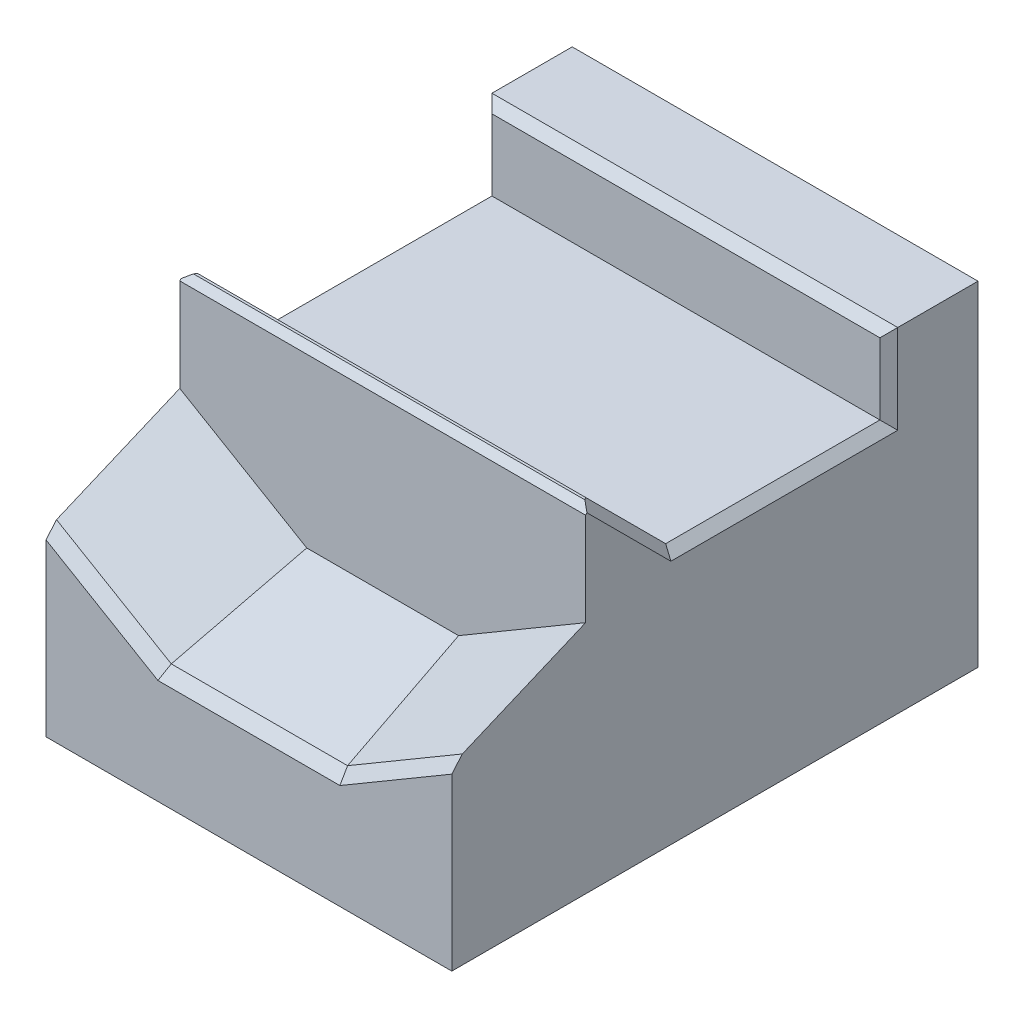
ISO-10303-21;
HEADER;
FILE_DESCRIPTION(('STEP AP214'),'2;1');
FILE_NAME('part.step','',(''),(''),'','','');
FILE_SCHEMA(('AUTOMOTIVE_DESIGN { 1 0 10303 214 1 1 1 1 }'));
ENDSEC;
DATA;
#1=APPLICATION_CONTEXT('core data for automotive mechanical design processes');
#2=APPLICATION_PROTOCOL_DEFINITION('international standard','automotive_design',2000,#1);
#3=PRODUCT_CONTEXT('',#1,'mechanical');
#4=PRODUCT('Part','Part','',(#3));
#5=PRODUCT_RELATED_PRODUCT_CATEGORY('part','',(#4));
#6=PRODUCT_DEFINITION_FORMATION('','',#4);
#7=PRODUCT_DEFINITION_CONTEXT('part definition',#1,'design');
#8=PRODUCT_DEFINITION('design','',#6,#7);
#9=PRODUCT_DEFINITION_SHAPE('','',#8);
#10=(LENGTH_UNIT() NAMED_UNIT(*) SI_UNIT(.MILLI.,.METRE.));
#11=(NAMED_UNIT(*) PLANE_ANGLE_UNIT() SI_UNIT($,.RADIAN.));
#12=(NAMED_UNIT(*) SI_UNIT($,.STERADIAN.) SOLID_ANGLE_UNIT());
#13=UNCERTAINTY_MEASURE_WITH_UNIT(LENGTH_MEASURE(1.E-05),#10,'distance_accuracy_value','');
#14=(GEOMETRIC_REPRESENTATION_CONTEXT(3) GLOBAL_UNCERTAINTY_ASSIGNED_CONTEXT((#13)) GLOBAL_UNIT_ASSIGNED_CONTEXT((#10,
#11,#12)) REPRESENTATION_CONTEXT('',''));
#15=CARTESIAN_POINT('',(0.,0.,0.));
#16=DIRECTION('',(0.,0.,1.));
#17=DIRECTION('',(1.,0.,0.));
#18=AXIS2_PLACEMENT_3D('',#15,#16,#17);
#19=CARTESIAN_POINT('',(455.,375.,880.));
#20=DIRECTION('',(0.,-1.,0.));
#21=DIRECTION('',(0.,0.,-1.));
#22=AXIS2_PLACEMENT_3D('',#19,#20,#21);
#23=PLANE('',#22);
#24=DIRECTION('',(0.,0.,-1.));
#25=VECTOR('',#24,1.);
#26=CARTESIAN_POINT('',(-455.,375.,880.));
#27=LINE('',#26,#25);
#28=CARTESIAN_POINT('',(-455.,375.,180.));
#29=VERTEX_POINT('',#28);
#30=CARTESIAN_POINT('',(-455.,375.,0.));
#31=VERTEX_POINT('',#30);
#32=EDGE_CURVE('E200',#29,#31,#27,.T.);
#33=ORIENTED_EDGE('',*,*,#32,.F.);
#34=DIRECTION('',(1.,0.,0.));
#35=VECTOR('',#34,1.);
#36=CARTESIAN_POINT('',(455.,375.,180.));
#37=LINE('',#36,#35);
#38=CARTESIAN_POINT('',(455.,375.,180.));
#39=VERTEX_POINT('',#38);
#40=EDGE_CURVE('E11',#29,#39,#37,.T.);
#41=ORIENTED_EDGE('',*,*,#40,.T.);
#42=DIRECTION('',(0.,0.,-1.));
#43=VECTOR('',#42,1.);
#44=CARTESIAN_POINT('',(455.,375.,880.));
#45=LINE('',#44,#43);
#46=CARTESIAN_POINT('',(455.,375.,0.));
#47=VERTEX_POINT('',#46);
#48=EDGE_CURVE('E213',#39,#47,#45,.T.);
#49=ORIENTED_EDGE('',*,*,#48,.T.);
#50=DIRECTION('',(-1.,0.,0.));
#51=VECTOR('',#50,1.);
#52=CARTESIAN_POINT('',(455.,375.,0.));
#53=LINE('',#52,#51);
#54=EDGE_CURVE('E205',#47,#31,#53,.T.);
#55=ORIENTED_EDGE('',*,*,#54,.T.);
#56=EDGE_LOOP('',(#33,#41,#49,#55));
#57=FACE_BOUND('',#56,.T.);
#58=ADVANCED_FACE('F43',(#57),#23,.F.);
#59=CARTESIAN_POINT('',(0.,0.,880.));
#60=DIRECTION('',(0.,0.,-1.));
#61=DIRECTION('',(-1.,0.,0.));
#62=AXIS2_PLACEMENT_3D('',#59,#60,#61);
#63=PLANE('',#62);
#64=DIRECTION('',(0.,1.,0.));
#65=VECTOR('',#64,1.);
#66=CARTESIAN_POINT('',(455.,-375.,880.));
#67=LINE('',#66,#65);
#68=CARTESIAN_POINT('',(455.,151.681443153843,880.));
#69=VERTEX_POINT('',#68);
#70=CARTESIAN_POINT('',(455.,360.5,880.));
#71=VERTEX_POINT('',#70);
#72=EDGE_CURVE('E214',#69,#71,#67,.T.);
#73=ORIENTED_EDGE('',*,*,#72,.T.);
#74=DIRECTION('',(-1.,0.,0.));
#75=VECTOR('',#74,1.);
#76=CARTESIAN_POINT('',(0.,360.5,880.));
#77=LINE('',#76,#75);
#78=CARTESIAN_POINT('',(-455.,360.5,880.));
#79=VERTEX_POINT('',#78);
#80=EDGE_CURVE('E236',#71,#79,#77,.T.);
#81=ORIENTED_EDGE('',*,*,#80,.T.);
#82=DIRECTION('',(0.,-1.,0.));
#83=VECTOR('',#82,1.);
#84=CARTESIAN_POINT('',(-455.,-375.,880.));
#85=LINE('',#84,#83);
#86=CARTESIAN_POINT('',(-455.,151.681443153843,880.));
#87=VERTEX_POINT('',#86);
#88=EDGE_CURVE('E206',#79,#87,#85,.T.);
#89=ORIENTED_EDGE('',*,*,#88,.T.);
#90=DIRECTION('',(0.86193421515777,-0.507020126563394,0.));
#91=VECTOR('',#90,1.);
#92=CARTESIAN_POINT('',(-144.637929727112,-30.8844805360909,880.));
#93=LINE('',#92,#91);
#94=CARTESIAN_POINT('',(-170.266366114231,-15.8089297201387,880.));
#95=VERTEX_POINT('',#94);
#96=EDGE_CURVE('E224',#87,#95,#93,.T.);
#97=ORIENTED_EDGE('',*,*,#96,.T.);
#98=DIRECTION('',(1.,0.,0.));
#99=VECTOR('',#98,1.);
#100=CARTESIAN_POINT('',(200.,-15.8089297201387,880.));
#101=LINE('',#100,#99);
#102=CARTESIAN_POINT('',(170.266366114231,-15.8089297201387,880.));
#103=VERTEX_POINT('',#102);
#104=EDGE_CURVE('E228',#95,#103,#101,.T.);
#105=ORIENTED_EDGE('',*,*,#104,.T.);
#106=DIRECTION('',(0.86193421515777,0.507020126563394,0.));
#107=VECTOR('',#106,1.);
#108=CARTESIAN_POINT('',(399.637929727112,119.115519463909,880.));
#109=LINE('',#108,#107);
#110=EDGE_CURVE('E226',#103,#69,#109,.T.);
#111=ORIENTED_EDGE('',*,*,#110,.T.);
#112=EDGE_LOOP('',(#73,#81,#89,#97,#105,#111));
#113=FACE_BOUND('',#112,.T.);
#114=ADVANCED_FACE('F360',(#113),#63,.F.);
#115=DIRECTION('',(-1.,0.,0.));
#116=VECTOR('',#115,1.);
#117=CARTESIAN_POINT('',(455.,375.,860.000000000003));
#118=LINE('',#117,#116);
#119=CARTESIAN_POINT('',(435.,375.,860.000000000003));
#120=VERTEX_POINT('',#119);
#121=CARTESIAN_POINT('',(-435.,375.,860.000000000003));
#122=VERTEX_POINT('',#121);
#123=EDGE_CURVE('E269',#120,#122,#118,.T.);
#124=ORIENTED_EDGE('',*,*,#123,.T.);
#125=DIRECTION('',(0.57735026918963,0.,-0.816496580927723));
#126=VECTOR('',#125,1.);
#127=CARTESIAN_POINT('',(-276.270683244605,375.,635.522847498312));
#128=LINE('',#127,#126);
#129=CARTESIAN_POINT('',(-438.889087296524,375.,865.5));
#130=VERTEX_POINT('',#129);
#131=EDGE_CURVE('E291',#122,#130,#128,.F.);
#132=ORIENTED_EDGE('',*,*,#131,.T.);
#133=DIRECTION('',(1.,0.,0.));
#134=VECTOR('',#133,1.);
#135=CARTESIAN_POINT('',(455.,375.,865.5));
#136=LINE('',#135,#134);
#137=CARTESIAN_POINT('',(438.889087296524,375.,865.5));
#138=VERTEX_POINT('',#137);
#139=EDGE_CURVE('E247',#130,#138,#136,.T.);
#140=ORIENTED_EDGE('',*,*,#139,.T.);
#141=DIRECTION('',(0.57735026918963,0.,0.816496580927723));
#142=VECTOR('',#141,1.);
#143=CARTESIAN_POINT('',(276.270683244605,375.,635.522847498312));
#144=LINE('',#143,#142);
#145=EDGE_CURVE('E293',#138,#120,#144,.F.);
#146=ORIENTED_EDGE('',*,*,#145,.T.);
#147=EDGE_LOOP('',(#124,#132,#140,#146));
#148=FACE_BOUND('',#147,.T.);
#149=ADVANCED_FACE('F399',(#148),#23,.F.);
#150=CARTESIAN_POINT('',(-455.,-375.,880.));
#151=DIRECTION('',(1.,0.,0.));
#152=DIRECTION('',(0.,0.,-1.));
#153=AXIS2_PLACEMENT_3D('',#150,#151,#152);
#154=PLANE('',#153);
#155=DIRECTION('',(0.,-0.707106781186542,0.707106781186553));
#156=VECTOR('',#155,1.);
#157=CARTESIAN_POINT('',(-455.,360.5,880.));
#158=LINE('',#157,#156);
#159=CARTESIAN_POINT('',(-455.,363.607864376268,876.892135623732));
#160=VERTEX_POINT('',#159);
#161=EDGE_CURVE('E246',#79,#160,#158,.F.);
#162=ORIENTED_EDGE('',*,*,#161,.T.);
#163=DIRECTION('',(0.,-0.707106781186544,-0.707106781186551));
#164=VECTOR('',#163,1.);
#165=CARTESIAN_POINT('',(-455.,181.237925885467,694.52219713293));
#166=LINE('',#165,#164);
#167=CARTESIAN_POINT('',(-455.,175.380061509198,688.664332756661));
#168=VERTEX_POINT('',#167);
#169=EDGE_CURVE('E284',#160,#168,#166,.T.);
#170=ORIENTED_EDGE('',*,*,#169,.T.);
#171=DIRECTION('',(0.,0.,-1.));
#172=VECTOR('',#171,1.);
#173=CARTESIAN_POINT('',(-455.,175.380061509198,880.));
#174=LINE('',#173,#172);
#175=CARTESIAN_POINT('',(-455.,175.380061509198,180.));
#176=VERTEX_POINT('',#175);
#177=EDGE_CURVE('E285',#168,#176,#174,.T.);
#178=ORIENTED_EDGE('',*,*,#177,.T.);
#179=DIRECTION('',(0.,1.,0.));
#180=VECTOR('',#179,1.);
#181=CARTESIAN_POINT('',(-455.,-375.,180.));
#182=LINE('',#181,#180);
#183=EDGE_CURVE('E277',#176,#29,#182,.T.);
#184=ORIENTED_EDGE('',*,*,#183,.T.);
#185=ORIENTED_EDGE('',*,*,#32,.T.);
#186=DIRECTION('',(0.,-1.,0.));
#187=VECTOR('',#186,1.);
#188=CARTESIAN_POINT('',(-455.,-375.,0.));
#189=LINE('',#188,#187);
#190=CARTESIAN_POINT('',(-455.,-375.,0.));
#191=VERTEX_POINT('',#190);
#192=EDGE_CURVE('E193',#31,#191,#189,.T.);
#193=ORIENTED_EDGE('',*,*,#192,.T.);
#194=DIRECTION('',(0.,0.,-1.));
#195=VECTOR('',#194,1.);
#196=CARTESIAN_POINT('',(-455.,-375.,880.));
#197=LINE('',#196,#195);
#198=CARTESIAN_POINT('',(-455.,-375.,1180.));
#199=VERTEX_POINT('',#198);
#200=EDGE_CURVE('E188',#199,#191,#197,.T.);
#201=ORIENTED_EDGE('',*,*,#200,.F.);
#202=DIRECTION('',(0.,-1.,0.));
#203=VECTOR('',#202,1.);
#204=CARTESIAN_POINT('',(-455.,-375.,1180.));
#205=LINE('',#204,#203);
#206=CARTESIAN_POINT('',(-455.,7.59727977354491,1180.));
#207=VERTEX_POINT('',#206);
#208=EDGE_CURVE('E176',#207,#199,#205,.T.);
#209=ORIENTED_EDGE('',*,*,#208,.F.);
#210=DIRECTION('',(0.,0.757460436382234,-0.652881066746184));
#211=VECTOR('',#210,1.);
#212=CARTESIAN_POINT('',(-455.,-84.2829391602115,1259.19470439519));
#213=LINE('',#212,#211);
#214=CARTESIAN_POINT('',(-455.,34.9587668674332,1156.41619809618));
#215=VERTEX_POINT('',#214);
#216=EDGE_CURVE('E263',#207,#215,#213,.T.);
#217=ORIENTED_EDGE('',*,*,#216,.T.);
#218=DIRECTION('',(0.,-0.389010546757677,0.921233300804575));
#219=VECTOR('',#218,1.);
#220=CARTESIAN_POINT('',(-455.,71.9791588157265,1068.74654966156));
#221=LINE('',#220,#219);
#222=EDGE_CURVE('E234',#215,#87,#221,.F.);
#223=ORIENTED_EDGE('',*,*,#222,.T.);
#224=ORIENTED_EDGE('',*,*,#88,.F.);
#225=EDGE_LOOP('',(#162,#170,#178,#184,#185,#193,#201,#209,#217,#223,#224));
#226=FACE_BOUND('',#225,.T.);
#227=ADVANCED_FACE('F191',(#226),#154,.F.);
#228=CARTESIAN_POINT('',(455.,-375.,880.));
#229=DIRECTION('',(0.,1.,0.));
#230=DIRECTION('',(0.,0.,1.));
#231=AXIS2_PLACEMENT_3D('',#228,#229,#230);
#232=PLANE('',#231);
#233=DIRECTION('',(1.,0.,0.));
#234=VECTOR('',#233,1.);
#235=CARTESIAN_POINT('',(455.,-375.,0.));
#236=LINE('',#235,#234);
#237=CARTESIAN_POINT('',(455.,-375.,0.));
#238=VERTEX_POINT('',#237);
#239=EDGE_CURVE('E220',#191,#238,#236,.T.);
#240=ORIENTED_EDGE('',*,*,#239,.T.);
#241=DIRECTION('',(0.,0.,-1.));
#242=VECTOR('',#241,1.);
#243=CARTESIAN_POINT('',(455.,-375.,880.));
#244=LINE('',#243,#242);
#245=CARTESIAN_POINT('',(455.,-375.,1180.));
#246=VERTEX_POINT('',#245);
#247=EDGE_CURVE('E196',#246,#238,#244,.T.);
#248=ORIENTED_EDGE('',*,*,#247,.F.);
#249=DIRECTION('',(1.,0.,0.));
#250=VECTOR('',#249,1.);
#251=CARTESIAN_POINT('',(-455.,-375.,1180.));
#252=LINE('',#251,#250);
#253=EDGE_CURVE('E181',#199,#246,#252,.T.);
#254=ORIENTED_EDGE('',*,*,#253,.F.);
#255=ORIENTED_EDGE('',*,*,#200,.T.);
#256=EDGE_LOOP('',(#240,#248,#254,#255));
#257=FACE_BOUND('',#256,.T.);
#258=ADVANCED_FACE('F197',(#257),#232,.F.);
#259=CARTESIAN_POINT('',(455.,-375.,880.));
#260=DIRECTION('',(-1.,0.,0.));
#261=DIRECTION('',(0.,0.,1.));
#262=AXIS2_PLACEMENT_3D('',#259,#260,#261);
#263=PLANE('',#262);
#264=DIRECTION('',(0.,0.,1.));
#265=VECTOR('',#264,1.);
#266=CARTESIAN_POINT('',(455.,175.380061509198,880.));
#267=LINE('',#266,#265);
#268=CARTESIAN_POINT('',(455.,175.380061509198,180.));
#269=VERTEX_POINT('',#268);
#270=CARTESIAN_POINT('',(455.,175.380061509198,688.664332756661));
#271=VERTEX_POINT('',#270);
#272=EDGE_CURVE('E301',#269,#271,#267,.T.);
#273=ORIENTED_EDGE('',*,*,#272,.T.);
#274=DIRECTION('',(0.,0.707106781186544,0.707106781186551));
#275=VECTOR('',#274,1.);
#276=CARTESIAN_POINT('',(455.,360.857864376269,874.142135623734));
#277=LINE('',#276,#275);
#278=CARTESIAN_POINT('',(455.,363.607864376268,876.892135623732));
#279=VERTEX_POINT('',#278);
#280=EDGE_CURVE('E303',#271,#279,#277,.T.);
#281=ORIENTED_EDGE('',*,*,#280,.T.);
#282=DIRECTION('',(0.,0.707106781186542,-0.707106781186553));
#283=VECTOR('',#282,1.);
#284=CARTESIAN_POINT('',(455.,360.5,880.));
#285=LINE('',#284,#283);
#286=EDGE_CURVE('E252',#279,#71,#285,.F.);
#287=ORIENTED_EDGE('',*,*,#286,.T.);
#288=ORIENTED_EDGE('',*,*,#72,.F.);
#289=DIRECTION('',(0.,0.389010546757677,-0.921233300804575));
#290=VECTOR('',#289,1.);
#291=CARTESIAN_POINT('',(455.,71.9791588157265,1068.74654966156));
#292=LINE('',#291,#290);
#293=CARTESIAN_POINT('',(455.,34.9587668674332,1156.41619809618));
#294=VERTEX_POINT('',#293);
#295=EDGE_CURVE('E233',#69,#294,#292,.F.);
#296=ORIENTED_EDGE('',*,*,#295,.T.);
#297=DIRECTION('',(0.,-0.757460436382234,0.652881066746184));
#298=VECTOR('',#297,1.);
#299=CARTESIAN_POINT('',(455.,-84.2829391602116,1259.19470439519));
#300=LINE('',#299,#298);
#301=CARTESIAN_POINT('',(455.,7.59727977354491,1180.));
#302=VERTEX_POINT('',#301);
#303=EDGE_CURVE('E270',#294,#302,#300,.T.);
#304=ORIENTED_EDGE('',*,*,#303,.T.);
#305=DIRECTION('',(0.,1.,0.));
#306=VECTOR('',#305,1.);
#307=CARTESIAN_POINT('',(455.,-375.,1180.));
#308=LINE('',#307,#306);
#309=EDGE_CURVE('E190',#246,#302,#308,.T.);
#310=ORIENTED_EDGE('',*,*,#309,.F.);
#311=ORIENTED_EDGE('',*,*,#247,.T.);
#312=DIRECTION('',(0.,1.,0.));
#313=VECTOR('',#312,1.);
#314=CARTESIAN_POINT('',(455.,-375.,0.));
#315=LINE('',#314,#313);
#316=EDGE_CURVE('E211',#238,#47,#315,.T.);
#317=ORIENTED_EDGE('',*,*,#316,.T.);
#318=ORIENTED_EDGE('',*,*,#48,.F.);
#319=DIRECTION('',(0.,-1.,0.));
#320=VECTOR('',#319,1.);
#321=CARTESIAN_POINT('',(455.,-375.,180.));
#322=LINE('',#321,#320);
#323=EDGE_CURVE('E299',#39,#269,#322,.T.);
#324=ORIENTED_EDGE('',*,*,#323,.T.);
#325=EDGE_LOOP('',(#273,#281,#287,#288,#296,#304,#310,#311,#317,#318,#324));
#326=FACE_BOUND('',#325,.T.);
#327=ADVANCED_FACE('F381',(#326),#263,.F.);
#328=CARTESIAN_POINT('',(0.,0.,0.));
#329=DIRECTION('',(0.,0.,-1.));
#330=DIRECTION('',(-1.,0.,0.));
#331=AXIS2_PLACEMENT_3D('',#328,#329,#330);
#332=PLANE('',#331);
#333=ORIENTED_EDGE('',*,*,#54,.F.);
#334=ORIENTED_EDGE('',*,*,#316,.F.);
#335=ORIENTED_EDGE('',*,*,#239,.F.);
#336=ORIENTED_EDGE('',*,*,#192,.F.);
#337=EDGE_LOOP('',(#333,#334,#335,#336));
#338=FACE_BOUND('',#337,.T.);
#339=ADVANCED_FACE('F432',(#338),#332,.T.);
#340=CARTESIAN_POINT('',(0.,0.,1180.));
#341=DIRECTION('',(0.,0.,-1.));
#342=DIRECTION('',(-1.,0.,0.));
#343=AXIS2_PLACEMENT_3D('',#340,#341,#342);
#344=PLANE('',#343);
#345=DIRECTION('',(-1.,0.,0.));
#346=VECTOR('',#345,1.);
#347=CARTESIAN_POINT('',(0.,-140.,1180.));
#348=LINE('',#347,#346);
#349=CARTESIAN_POINT('',(204.084624384974,-140.,1180.));
#350=VERTEX_POINT('',#349);
#351=CARTESIAN_POINT('',(-204.084624384974,-140.,1180.));
#352=VERTEX_POINT('',#351);
#353=EDGE_CURVE('E260',#350,#352,#348,.T.);
#354=ORIENTED_EDGE('',*,*,#353,.T.);
#355=DIRECTION('',(-0.86193421515777,0.507020126563394,0.));
#356=VECTOR('',#355,1.);
#357=CARTESIAN_POINT('',(-113.646433003849,-193.198936106544,1180.));
#358=LINE('',#357,#356);
#359=EDGE_CURVE('E183',#352,#207,#358,.T.);
#360=ORIENTED_EDGE('',*,*,#359,.T.);
#361=ORIENTED_EDGE('',*,*,#208,.T.);
#362=ORIENTED_EDGE('',*,*,#253,.T.);
#363=ORIENTED_EDGE('',*,*,#309,.T.);
#364=DIRECTION('',(-0.86193421515777,-0.507020126563394,0.));
#365=VECTOR('',#364,1.);
#366=CARTESIAN_POINT('',(113.646433003849,-193.198936106544,1180.));
#367=LINE('',#366,#365);
#368=EDGE_CURVE('E259',#302,#350,#367,.T.);
#369=ORIENTED_EDGE('',*,*,#368,.T.);
#370=EDGE_LOOP('',(#354,#360,#361,#362,#363,#369));
#371=FACE_BOUND('',#370,.T.);
#372=ADVANCED_FACE('F178',(#371),#344,.F.);
#373=CARTESIAN_POINT('',(-50.6790608325107,-86.1544034152682,880.));
#374=DIRECTION('',(0.476443071521558,0.809953221586648,0.342020143325673));
#375=DIRECTION('',(-0.86193421515777,0.507020126563394,0.));
#376=AXIS2_PLACEMENT_3D('',#373,#374,#375);
#377=PLANE('',#376);
#378=ORIENTED_EDGE('',*,*,#222,.F.);
#379=DIRECTION('',(-0.86193421515777,0.507020126563394,0.));
#380=VECTOR('',#379,1.);
#381=CARTESIAN_POINT('',(-101.688970777728,-172.871250322138,1156.41619809618));
#382=LINE('',#381,#380);
#383=CARTESIAN_POINT('',(-197.662559561858,-116.41619809618,1156.41619809618));
#384=VERTEX_POINT('',#383);
#385=EDGE_CURVE('E254',#215,#384,#382,.F.);
#386=ORIENTED_EDGE('',*,*,#385,.T.);
#387=DIRECTION('',(0.0927335986900488,0.340546363447216,-0.935643443848601));
#388=VECTOR('',#387,1.);
#389=CARTESIAN_POINT('',(-168.802157037996,-10.4319025877749,865.226739370036));
#390=LINE('',#389,#388);
#391=EDGE_CURVE('E239',#95,#384,#390,.F.);
#392=ORIENTED_EDGE('',*,*,#391,.F.);
#393=ORIENTED_EDGE('',*,*,#96,.F.);
#394=EDGE_LOOP('',(#378,#386,#392,#393));
#395=FACE_BOUND('',#394,.T.);
#396=ADVANCED_FACE('F352',(#395),#377,.T.);
#397=CARTESIAN_POINT('',(0.,-15.8089297201387,880.));
#398=DIRECTION('',(0.,0.939692620785907,0.342020143325673));
#399=DIRECTION('',(-1.,0.,0.));
#400=AXIS2_PLACEMENT_3D('',#397,#398,#399);
#401=PLANE('',#400);
#402=ORIENTED_EDGE('',*,*,#391,.T.);
#403=DIRECTION('',(-1.,0.,0.));
#404=VECTOR('',#403,1.);
#405=CARTESIAN_POINT('',(0.,-116.41619809618,1156.41619809618));
#406=LINE('',#405,#404);
#407=CARTESIAN_POINT('',(197.662559561858,-116.41619809618,1156.41619809618));
#408=VERTEX_POINT('',#407);
#409=EDGE_CURVE('E261',#384,#408,#406,.F.);
#410=ORIENTED_EDGE('',*,*,#409,.T.);
#411=DIRECTION('',(-0.0927335986900488,0.340546363447216,-0.935643443848601));
#412=VECTOR('',#411,1.);
#413=CARTESIAN_POINT('',(171.459489028274,-20.1904448911503,892.038113995352));
#414=LINE('',#413,#412);
#415=EDGE_CURVE('E240',#103,#408,#414,.F.);
#416=ORIENTED_EDGE('',*,*,#415,.F.);
#417=ORIENTED_EDGE('',*,*,#104,.F.);
#418=EDGE_LOOP('',(#402,#410,#416,#417));
#419=FACE_BOUND('',#418,.T.);
#420=ADVANCED_FACE('F462',(#419),#401,.T.);
#421=CARTESIAN_POINT('',(50.6790608325107,-86.1544034152683,880.));
#422=DIRECTION('',(-0.476443071521558,0.809953221586648,0.342020143325673));
#423=DIRECTION('',(-0.86193421515777,-0.507020126563394,0.));
#424=AXIS2_PLACEMENT_3D('',#421,#422,#423);
#425=PLANE('',#424);
#426=ORIENTED_EDGE('',*,*,#415,.T.);
#427=DIRECTION('',(-0.86193421515777,-0.507020126563394,0.));
#428=VECTOR('',#427,1.);
#429=CARTESIAN_POINT('',(101.688970777728,-172.871250322138,1156.41619809618));
#430=LINE('',#429,#428);
#431=EDGE_CURVE('E262',#408,#294,#430,.F.);
#432=ORIENTED_EDGE('',*,*,#431,.T.);
#433=ORIENTED_EDGE('',*,*,#295,.F.);
#434=ORIENTED_EDGE('',*,*,#110,.F.);
#435=EDGE_LOOP('',(#426,#432,#433,#434));
#436=FACE_BOUND('',#435,.T.);
#437=ADVANCED_FACE('F475',(#436),#425,.T.);
#438=CARTESIAN_POINT('',(0.,360.5,880.));
#439=DIRECTION('',(0.,-0.707106781186553,-0.707106781186542));
#440=DIRECTION('',(-1.,0.,0.));
#441=AXIS2_PLACEMENT_3D('',#438,#439,#440);
#442=PLANE('',#441);
#443=ORIENTED_EDGE('',*,*,#139,.F.);
#444=DIRECTION('',(-0.707106781186553,-0.499999999999992,0.5));
#445=VECTOR('',#444,1.);
#446=CARTESIAN_POINT('',(-229.697591975463,522.920724908072,717.579275091925));
#447=LINE('',#446,#445);
#448=EDGE_CURVE('E300',#130,#160,#447,.T.);
#449=ORIENTED_EDGE('',*,*,#448,.T.);
#450=ORIENTED_EDGE('',*,*,#161,.F.);
#451=ORIENTED_EDGE('',*,*,#80,.F.);
#452=ORIENTED_EDGE('',*,*,#286,.F.);
#453=DIRECTION('',(-0.707106781186553,0.499999999999992,-0.5));
#454=VECTOR('',#453,1.);
#455=CARTESIAN_POINT('',(229.697591975463,522.920724908072,717.579275091925));
#456=LINE('',#455,#454);
#457=EDGE_CURVE('E294',#279,#138,#456,.T.);
#458=ORIENTED_EDGE('',*,*,#457,.T.);
#459=EDGE_LOOP('',(#443,#449,#450,#451,#452,#458));
#460=FACE_BOUND('',#459,.T.);
#461=ADVANCED_FACE('F485',(#460),#442,.F.);
#462=CARTESIAN_POINT('',(101.688970777728,-172.871250322138,1156.41619809618));
#463=DIRECTION('',(-0.358517369691038,0.609479528474764,0.707106781186547));
#464=DIRECTION('',(-0.86193421515777,-0.507020126563394,0.));
#465=AXIS2_PLACEMENT_3D('',#462,#463,#464);
#466=PLANE('',#465);
#467=ORIENTED_EDGE('',*,*,#303,.F.);
#468=ORIENTED_EDGE('',*,*,#431,.F.);
#469=DIRECTION('',(0.189077824692164,-0.694352063513056,0.694352063513057));
#470=VECTOR('',#469,1.);
#471=CARTESIAN_POINT('',(190.596039290042,-90.4657571040606,1130.46575710406));
#472=LINE('',#471,#470);
#473=EDGE_CURVE('E241',#350,#408,#472,.F.);
#474=ORIENTED_EDGE('',*,*,#473,.F.);
#475=ORIENTED_EDGE('',*,*,#368,.F.);
#476=EDGE_LOOP('',(#467,#468,#474,#475));
#477=FACE_BOUND('',#476,.T.);
#478=ADVANCED_FACE('F344',(#477),#466,.T.);
#479=CARTESIAN_POINT('',(0.,-116.41619809618,1156.41619809618));
#480=DIRECTION('',(0.,0.707106781186548,0.707106781186547));
#481=DIRECTION('',(-1.,0.,0.));
#482=AXIS2_PLACEMENT_3D('',#479,#480,#481);
#483=PLANE('',#482);
#484=ORIENTED_EDGE('',*,*,#473,.T.);
#485=ORIENTED_EDGE('',*,*,#409,.F.);
#486=DIRECTION('',(-0.189077824692163,-0.694352063513056,0.694352063513057));
#487=VECTOR('',#486,1.);
#488=CARTESIAN_POINT('',(-201.643253693002,-131.034534163215,1171.03453416322));
#489=LINE('',#488,#487);
#490=EDGE_CURVE('E267',#352,#384,#489,.F.);
#491=ORIENTED_EDGE('',*,*,#490,.F.);
#492=ORIENTED_EDGE('',*,*,#353,.F.);
#493=EDGE_LOOP('',(#484,#485,#491,#492));
#494=FACE_BOUND('',#493,.T.);
#495=ADVANCED_FACE('F350',(#494),#483,.T.);
#496=CARTESIAN_POINT('',(-101.688970777728,-172.871250322138,1156.41619809618));
#497=DIRECTION('',(0.358517369691038,0.609479528474764,0.707106781186547));
#498=DIRECTION('',(-0.86193421515777,0.507020126563394,0.));
#499=AXIS2_PLACEMENT_3D('',#496,#497,#498);
#500=PLANE('',#499);
#501=ORIENTED_EDGE('',*,*,#216,.F.);
#502=ORIENTED_EDGE('',*,*,#359,.F.);
#503=ORIENTED_EDGE('',*,*,#490,.T.);
#504=ORIENTED_EDGE('',*,*,#385,.F.);
#505=EDGE_LOOP('',(#501,#502,#503,#504));
#506=FACE_BOUND('',#505,.T.);
#507=ADVANCED_FACE('F349',(#506),#500,.T.);
#508=CARTESIAN_POINT('',(455.,195.380061509198,200.));
#509=DIRECTION('',(0.,-1.,0.));
#510=DIRECTION('',(0.,0.,-1.));
#511=AXIS2_PLACEMENT_3D('',#508,#509,#510);
#512=PLANE('',#511);
#513=DIRECTION('',(-1.,0.,0.));
#514=VECTOR('',#513,1.);
#515=CARTESIAN_POINT('',(455.,195.380061509198,680.380061509199));
#516=LINE('',#515,#514);
#517=CARTESIAN_POINT('',(-435.,195.380061509198,680.380061509199));
#518=VERTEX_POINT('',#517);
#519=CARTESIAN_POINT('',(435.,195.380061509198,680.380061509199));
#520=VERTEX_POINT('',#519);
#521=EDGE_CURVE('E276',#518,#520,#516,.F.);
#522=ORIENTED_EDGE('',*,*,#521,.T.);
#523=DIRECTION('',(0.,0.,-1.));
#524=VECTOR('',#523,1.);
#525=CARTESIAN_POINT('',(435.,195.380061509198,200.));
#526=LINE('',#525,#524);
#527=CARTESIAN_POINT('',(435.,195.380061509198,200.));
#528=VERTEX_POINT('',#527);
#529=EDGE_CURVE('E310',#520,#528,#526,.T.);
#530=ORIENTED_EDGE('',*,*,#529,.T.);
#531=DIRECTION('',(-1.,0.,0.));
#532=VECTOR('',#531,1.);
#533=CARTESIAN_POINT('',(455.,195.380061509198,200.));
#534=LINE('',#533,#532);
#535=CARTESIAN_POINT('',(-435.,195.380061509198,200.));
#536=VERTEX_POINT('',#535);
#537=EDGE_CURVE('E275',#528,#536,#534,.T.);
#538=ORIENTED_EDGE('',*,*,#537,.T.);
#539=DIRECTION('',(0.,0.,1.));
#540=VECTOR('',#539,1.);
#541=CARTESIAN_POINT('',(-435.,195.380061509198,200.));
#542=LINE('',#541,#540);
#543=EDGE_CURVE('E304',#536,#518,#542,.T.);
#544=ORIENTED_EDGE('',*,*,#543,.T.);
#545=EDGE_LOOP('',(#522,#530,#538,#544));
#546=FACE_BOUND('',#545,.T.);
#547=ADVANCED_FACE('F422',(#546),#512,.F.);
#548=CARTESIAN_POINT('',(455.,375.,200.));
#549=DIRECTION('',(0.,0.,-1.));
#550=DIRECTION('',(-1.,0.,0.));
#551=AXIS2_PLACEMENT_3D('',#548,#549,#550);
#552=PLANE('',#551);
#553=DIRECTION('',(-1.,0.,0.));
#554=VECTOR('',#553,1.);
#555=CARTESIAN_POINT('',(455.,355.,200.));
#556=LINE('',#555,#554);
#557=CARTESIAN_POINT('',(435.,355.,200.));
#558=VERTEX_POINT('',#557);
#559=CARTESIAN_POINT('',(-435.,355.,200.));
#560=VERTEX_POINT('',#559);
#561=EDGE_CURVE('E64',#558,#560,#556,.T.);
#562=ORIENTED_EDGE('',*,*,#561,.T.);
#563=DIRECTION('',(0.,-1.,0.));
#564=VECTOR('',#563,1.);
#565=CARTESIAN_POINT('',(-435.,375.,200.));
#566=LINE('',#565,#564);
#567=EDGE_CURVE('E52',#560,#536,#566,.T.);
#568=ORIENTED_EDGE('',*,*,#567,.T.);
#569=ORIENTED_EDGE('',*,*,#537,.F.);
#570=DIRECTION('',(0.,1.,0.));
#571=VECTOR('',#570,1.);
#572=CARTESIAN_POINT('',(435.,375.,200.));
#573=LINE('',#572,#571);
#574=EDGE_CURVE('E68',#528,#558,#573,.T.);
#575=ORIENTED_EDGE('',*,*,#574,.T.);
#576=EDGE_LOOP('',(#562,#568,#569,#575));
#577=FACE_BOUND('',#576,.T.);
#578=ADVANCED_FACE('F421',(#577),#552,.F.);
#579=CARTESIAN_POINT('',(455.,375.,860.000000000003));
#580=DIRECTION('',(0.,-0.707106781186551,0.707106781186544));
#581=DIRECTION('',(-1.,0.,0.));
#582=AXIS2_PLACEMENT_3D('',#579,#580,#581);
#583=PLANE('',#582);
#584=ORIENTED_EDGE('',*,*,#521,.F.);
#585=DIRECTION('',(0.,-0.707106781186544,-0.707106781186551));
#586=VECTOR('',#585,1.);
#587=CARTESIAN_POINT('',(-435.,375.,860.000000000003));
#588=LINE('',#587,#586);
#589=EDGE_CURVE('E289',#518,#122,#588,.F.);
#590=ORIENTED_EDGE('',*,*,#589,.T.);
#591=ORIENTED_EDGE('',*,*,#123,.F.);
#592=DIRECTION('',(0.,0.707106781186544,0.707106781186551));
#593=VECTOR('',#592,1.);
#594=CARTESIAN_POINT('',(435.,195.380061509198,680.380061509199));
#595=LINE('',#594,#593);
#596=EDGE_CURVE('E290',#120,#520,#595,.F.);
#597=ORIENTED_EDGE('',*,*,#596,.T.);
#598=EDGE_LOOP('',(#584,#590,#591,#597));
#599=FACE_BOUND('',#598,.T.);
#600=ADVANCED_FACE('F416',(#599),#583,.F.);
#601=CARTESIAN_POINT('',(455.,-4.14213562372873,509.142135623732));
#602=DIRECTION('',(-0.707106781186542,-0.500000000000006,0.500000000000001));
#603=DIRECTION('',(0.,0.707106781186544,0.707106781186551));
#604=AXIS2_PLACEMENT_3D('',#601,#602,#603);
#605=PLANE('',#604);
#606=ORIENTED_EDGE('',*,*,#457,.F.);
#607=ORIENTED_EDGE('',*,*,#280,.F.);
#608=DIRECTION('',(0.678598344545853,-0.678598344545843,0.281084637714815));
#609=VECTOR('',#608,1.);
#610=CARTESIAN_POINT('',(503.426497462657,126.953564046542,708.723244783919));
#611=LINE('',#610,#609);
#612=EDGE_CURVE('E48',#520,#271,#611,.T.);
#613=ORIENTED_EDGE('',*,*,#612,.F.);
#614=ORIENTED_EDGE('',*,*,#596,.F.);
#615=ORIENTED_EDGE('',*,*,#145,.F.);
#616=EDGE_LOOP('',(#606,#607,#613,#614,#615));
#617=FACE_BOUND('',#616,.T.);
#618=ADVANCED_FACE('F46',(#617),#605,.F.);
#619=CARTESIAN_POINT('',(455.,175.380061509198,880.));
#620=DIRECTION('',(-0.707106781186542,-0.707106781186552,0.));
#621=DIRECTION('',(0.,0.,1.));
#622=AXIS2_PLACEMENT_3D('',#619,#620,#621);
#623=PLANE('',#622);
#624=ORIENTED_EDGE('',*,*,#612,.T.);
#625=ORIENTED_EDGE('',*,*,#272,.F.);
#626=DIRECTION('',(0.577350269189627,-0.577350269189619,-0.577350269189632));
#627=VECTOR('',#626,1.);
#628=CARTESIAN_POINT('',(221.666666666664,408.713394842531,413.333333333338));
#629=LINE('',#628,#627);
#630=EDGE_CURVE('E321',#528,#269,#629,.T.);
#631=ORIENTED_EDGE('',*,*,#630,.F.);
#632=ORIENTED_EDGE('',*,*,#529,.F.);
#633=EDGE_LOOP('',(#624,#625,#631,#632));
#634=FACE_BOUND('',#633,.T.);
#635=ADVANCED_FACE('F388',(#634),#623,.F.);
#636=CARTESIAN_POINT('',(455.,-375.,180.));
#637=DIRECTION('',(-0.70710678118655,0.,-0.707106781186544));
#638=DIRECTION('',(0.,-1.,0.));
#639=AXIS2_PLACEMENT_3D('',#636,#637,#638);
#640=PLANE('',#639);
#641=ORIENTED_EDGE('',*,*,#630,.T.);
#642=ORIENTED_EDGE('',*,*,#323,.F.);
#643=DIRECTION('',(0.577350269189624,0.577350269189624,-0.577350269189629));
#644=VECTOR('',#643,1.);
#645=CARTESIAN_POINT('',(441.666666666667,361.666666666667,193.333333333333));
#646=LINE('',#645,#644);
#647=EDGE_CURVE('E318',#558,#39,#646,.T.);
#648=ORIENTED_EDGE('',*,*,#647,.F.);
#649=ORIENTED_EDGE('',*,*,#574,.F.);
#650=EDGE_LOOP('',(#641,#642,#648,#649));
#651=FACE_BOUND('',#650,.T.);
#652=ADVANCED_FACE('F386',(#651),#640,.F.);
#653=CARTESIAN_POINT('',(455.,355.,200.));
#654=DIRECTION('',(0.,-0.70710678118655,-0.707106781186544));
#655=DIRECTION('',(-1.,0.,0.));
#656=AXIS2_PLACEMENT_3D('',#653,#654,#655);
#657=PLANE('',#656);
#658=ORIENTED_EDGE('',*,*,#647,.T.);
#659=ORIENTED_EDGE('',*,*,#40,.F.);
#660=DIRECTION('',(0.577350269189624,-0.577350269189624,0.577350269189629));
#661=VECTOR('',#660,1.);
#662=CARTESIAN_POINT('',(-138.333333333335,58.333333333335,496.666666666667));
#663=LINE('',#662,#661);
#664=EDGE_CURVE('E320',#560,#29,#663,.F.);
#665=ORIENTED_EDGE('',*,*,#664,.F.);
#666=ORIENTED_EDGE('',*,*,#561,.F.);
#667=EDGE_LOOP('',(#658,#659,#665,#666));
#668=FACE_BOUND('',#667,.T.);
#669=ADVANCED_FACE('F382',(#668),#657,.F.);
#670=CARTESIAN_POINT('',(-435.,375.,200.));
#671=DIRECTION('',(0.70710678118655,0.,-0.707106781186544));
#672=DIRECTION('',(0.,-1.,0.));
#673=AXIS2_PLACEMENT_3D('',#670,#671,#672);
#674=PLANE('',#673);
#675=ORIENTED_EDGE('',*,*,#664,.T.);
#676=ORIENTED_EDGE('',*,*,#183,.F.);
#677=DIRECTION('',(0.577350269189623,0.577350269189627,0.577350269189627));
#678=VECTOR('',#677,1.);
#679=CARTESIAN_POINT('',(-435.,195.380061509198,200.));
#680=LINE('',#679,#678);
#681=EDGE_CURVE('E313',#536,#176,#680,.F.);
#682=ORIENTED_EDGE('',*,*,#681,.F.);
#683=ORIENTED_EDGE('',*,*,#567,.F.);
#684=EDGE_LOOP('',(#675,#676,#682,#683));
#685=FACE_BOUND('',#684,.T.);
#686=ADVANCED_FACE('F380',(#685),#674,.F.);
#687=CARTESIAN_POINT('',(-435.,195.380061509198,200.));
#688=DIRECTION('',(0.70710678118655,-0.707106781186544,0.));
#689=DIRECTION('',(0.,0.,1.));
#690=AXIS2_PLACEMENT_3D('',#687,#688,#689);
#691=PLANE('',#690);
#692=ORIENTED_EDGE('',*,*,#681,.T.);
#693=ORIENTED_EDGE('',*,*,#177,.F.);
#694=DIRECTION('',(0.678598344545849,0.678598344545854,-0.281084637714799));
#695=VECTOR('',#694,1.);
#696=CARTESIAN_POINT('',(-503.42649746266,126.953564046538,708.723244783919));
#697=LINE('',#696,#695);
#698=EDGE_CURVE('E315',#518,#168,#697,.F.);
#699=ORIENTED_EDGE('',*,*,#698,.F.);
#700=ORIENTED_EDGE('',*,*,#543,.F.);
#701=EDGE_LOOP('',(#692,#693,#699,#700));
#702=FACE_BOUND('',#701,.T.);
#703=ADVANCED_FACE('F373',(#702),#691,.F.);
#704=CARTESIAN_POINT('',(-455.,-4.14213562372873,509.142135623732));
#705=DIRECTION('',(0.707106781186542,-0.500000000000006,0.500000000000001));
#706=DIRECTION('',(0.,-0.707106781186544,-0.707106781186551));
#707=AXIS2_PLACEMENT_3D('',#704,#705,#706);
#708=PLANE('',#707);
#709=ORIENTED_EDGE('',*,*,#131,.F.);
#710=ORIENTED_EDGE('',*,*,#589,.F.);
#711=ORIENTED_EDGE('',*,*,#698,.T.);
#712=ORIENTED_EDGE('',*,*,#169,.F.);
#713=ORIENTED_EDGE('',*,*,#448,.F.);
#714=EDGE_LOOP('',(#709,#710,#711,#712,#713));
#715=FACE_BOUND('',#714,.T.);
#716=ADVANCED_FACE('F370',(#715),#708,.F.);
#717=CLOSED_SHELL('',(#58,#114,#149,#227,#258,#327,#339,#372,#396,#420,#437,#461,#478,#495,#507,
#547,#578,#600,#618,#635,#652,#669,#686,#703,#716));
#718=MANIFOLD_SOLID_BREP('B2',#717);
#719=ADVANCED_BREP_SHAPE_REPRESENTATION('',(#18,#718),#14);
#720=SHAPE_DEFINITION_REPRESENTATION(#9,#719);
ENDSEC;
END-ISO-10303-21;
